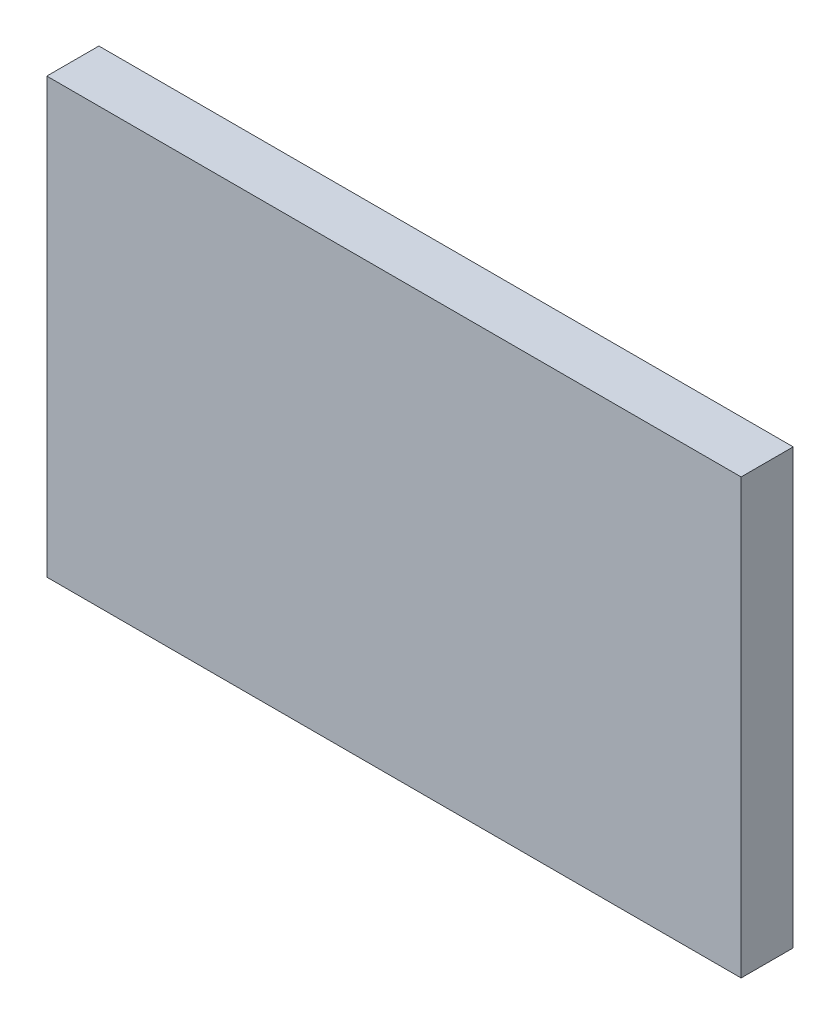
ISO-10303-21;
HEADER;
FILE_DESCRIPTION(('STEP AP214'),'2;1');
FILE_NAME('part.step','',(''),(''),'','','');
FILE_SCHEMA(('AUTOMOTIVE_DESIGN { 1 0 10303 214 1 1 1 1 }'));
ENDSEC;
DATA;
#1=APPLICATION_CONTEXT('core data for automotive mechanical design processes');
#2=APPLICATION_PROTOCOL_DEFINITION('international standard','automotive_design',2000,#1);
#3=PRODUCT_CONTEXT('',#1,'mechanical');
#4=PRODUCT('Part','Part','',(#3));
#5=PRODUCT_RELATED_PRODUCT_CATEGORY('part','',(#4));
#6=PRODUCT_DEFINITION_FORMATION('','',#4);
#7=PRODUCT_DEFINITION_CONTEXT('part definition',#1,'design');
#8=PRODUCT_DEFINITION('design','',#6,#7);
#9=PRODUCT_DEFINITION_SHAPE('','',#8);
#10=(LENGTH_UNIT() NAMED_UNIT(*) SI_UNIT(.MILLI.,.METRE.));
#11=(NAMED_UNIT(*) PLANE_ANGLE_UNIT() SI_UNIT($,.RADIAN.));
#12=(NAMED_UNIT(*) SI_UNIT($,.STERADIAN.) SOLID_ANGLE_UNIT());
#13=UNCERTAINTY_MEASURE_WITH_UNIT(LENGTH_MEASURE(1.E-05),#10,'distance_accuracy_value','');
#14=(GEOMETRIC_REPRESENTATION_CONTEXT(3) GLOBAL_UNCERTAINTY_ASSIGNED_CONTEXT((#13)) GLOBAL_UNIT_ASSIGNED_CONTEXT((#10,
#11,#12)) REPRESENTATION_CONTEXT('',''));
#15=CARTESIAN_POINT('',(0.,0.,0.));
#16=DIRECTION('',(0.,0.,1.));
#17=DIRECTION('',(1.,0.,0.));
#18=AXIS2_PLACEMENT_3D('',#15,#16,#17);
#19=CARTESIAN_POINT('',(40.,25.,6.));
#20=DIRECTION('',(-1.,0.,0.));
#21=DIRECTION('',(0.,-1.,0.));
#22=AXIS2_PLACEMENT_3D('',#19,#20,#21);
#23=PLANE('',#22);
#24=DIRECTION('',(0.,1.,0.));
#25=VECTOR('',#24,1.);
#26=CARTESIAN_POINT('',(40.,25.,0.));
#27=LINE('',#26,#25);
#28=CARTESIAN_POINT('',(40.,-25.,0.));
#29=VERTEX_POINT('',#28);
#30=CARTESIAN_POINT('',(40.,25.,0.));
#31=VERTEX_POINT('',#30);
#32=EDGE_CURVE('E99',#29,#31,#27,.T.);
#33=ORIENTED_EDGE('',*,*,#32,.T.);
#34=DIRECTION('',(0.,0.,-1.));
#35=VECTOR('',#34,1.);
#36=CARTESIAN_POINT('',(40.,25.,6.));
#37=LINE('',#36,#35);
#38=CARTESIAN_POINT('',(40.,25.,6.));
#39=VERTEX_POINT('',#38);
#40=EDGE_CURVE('E11',#39,#31,#37,.T.);
#41=ORIENTED_EDGE('',*,*,#40,.F.);
#42=DIRECTION('',(0.,1.,0.));
#43=VECTOR('',#42,1.);
#44=CARTESIAN_POINT('',(40.,25.,6.));
#45=LINE('',#44,#43);
#46=CARTESIAN_POINT('',(40.,-25.,6.));
#47=VERTEX_POINT('',#46);
#48=EDGE_CURVE('E87',#47,#39,#45,.T.);
#49=ORIENTED_EDGE('',*,*,#48,.F.);
#50=DIRECTION('',(0.,0.,-1.));
#51=VECTOR('',#50,1.);
#52=CARTESIAN_POINT('',(40.,-25.,6.));
#53=LINE('',#52,#51);
#54=EDGE_CURVE('E95',#47,#29,#53,.T.);
#55=ORIENTED_EDGE('',*,*,#54,.T.);
#56=EDGE_LOOP('',(#33,#41,#49,#55));
#57=FACE_BOUND('',#56,.T.);
#58=ADVANCED_FACE('F36',(#57),#23,.F.);
#59=CARTESIAN_POINT('',(-40.,25.,6.));
#60=DIRECTION('',(0.,-1.,0.));
#61=DIRECTION('',(0.,0.,-1.));
#62=AXIS2_PLACEMENT_3D('',#59,#60,#61);
#63=PLANE('',#62);
#64=DIRECTION('',(-1.,0.,0.));
#65=VECTOR('',#64,1.);
#66=CARTESIAN_POINT('',(-40.,25.,0.));
#67=LINE('',#66,#65);
#68=CARTESIAN_POINT('',(-40.,25.,0.));
#69=VERTEX_POINT('',#68);
#70=EDGE_CURVE('E91',#31,#69,#67,.T.);
#71=ORIENTED_EDGE('',*,*,#70,.T.);
#72=DIRECTION('',(0.,0.,-1.));
#73=VECTOR('',#72,1.);
#74=CARTESIAN_POINT('',(-40.,25.,6.));
#75=LINE('',#74,#73);
#76=CARTESIAN_POINT('',(-40.,25.,6.));
#77=VERTEX_POINT('',#76);
#78=EDGE_CURVE('E44',#77,#69,#75,.T.);
#79=ORIENTED_EDGE('',*,*,#78,.F.);
#80=DIRECTION('',(-1.,0.,0.));
#81=VECTOR('',#80,1.);
#82=CARTESIAN_POINT('',(-40.,25.,6.));
#83=LINE('',#82,#81);
#84=EDGE_CURVE('E82',#39,#77,#83,.T.);
#85=ORIENTED_EDGE('',*,*,#84,.F.);
#86=ORIENTED_EDGE('',*,*,#40,.T.);
#87=EDGE_LOOP('',(#71,#79,#85,#86));
#88=FACE_BOUND('',#87,.T.);
#89=ADVANCED_FACE('F90',(#88),#63,.F.);
#90=CARTESIAN_POINT('',(-40.,25.,6.));
#91=DIRECTION('',(1.,0.,0.));
#92=DIRECTION('',(0.,1.,0.));
#93=AXIS2_PLACEMENT_3D('',#90,#91,#92);
#94=PLANE('',#93);
#95=DIRECTION('',(0.,-1.,0.));
#96=VECTOR('',#95,1.);
#97=CARTESIAN_POINT('',(-40.,25.,0.));
#98=LINE('',#97,#96);
#99=CARTESIAN_POINT('',(-40.,-25.,0.));
#100=VERTEX_POINT('',#99);
#101=EDGE_CURVE('E69',#69,#100,#98,.T.);
#102=ORIENTED_EDGE('',*,*,#101,.T.);
#103=DIRECTION('',(0.,0.,-1.));
#104=VECTOR('',#103,1.);
#105=CARTESIAN_POINT('',(-40.,-25.,6.));
#106=LINE('',#105,#104);
#107=CARTESIAN_POINT('',(-40.,-25.,6.));
#108=VERTEX_POINT('',#107);
#109=EDGE_CURVE('E92',#108,#100,#106,.T.);
#110=ORIENTED_EDGE('',*,*,#109,.F.);
#111=DIRECTION('',(0.,-1.,0.));
#112=VECTOR('',#111,1.);
#113=CARTESIAN_POINT('',(-40.,25.,6.));
#114=LINE('',#113,#112);
#115=EDGE_CURVE('E85',#77,#108,#114,.T.);
#116=ORIENTED_EDGE('',*,*,#115,.F.);
#117=ORIENTED_EDGE('',*,*,#78,.T.);
#118=EDGE_LOOP('',(#102,#110,#116,#117));
#119=FACE_BOUND('',#118,.T.);
#120=ADVANCED_FACE('F93',(#119),#94,.F.);
#121=CARTESIAN_POINT('',(-40.,-25.,6.));
#122=DIRECTION('',(0.,1.,0.));
#123=DIRECTION('',(0.,0.,1.));
#124=AXIS2_PLACEMENT_3D('',#121,#122,#123);
#125=PLANE('',#124);
#126=DIRECTION('',(1.,0.,0.));
#127=VECTOR('',#126,1.);
#128=CARTESIAN_POINT('',(-40.,-25.,0.));
#129=LINE('',#128,#127);
#130=EDGE_CURVE('E75',#100,#29,#129,.T.);
#131=ORIENTED_EDGE('',*,*,#130,.T.);
#132=ORIENTED_EDGE('',*,*,#54,.F.);
#133=DIRECTION('',(1.,0.,0.));
#134=VECTOR('',#133,1.);
#135=CARTESIAN_POINT('',(-40.,-25.,6.));
#136=LINE('',#135,#134);
#137=EDGE_CURVE('E52',#108,#47,#136,.T.);
#138=ORIENTED_EDGE('',*,*,#137,.F.);
#139=ORIENTED_EDGE('',*,*,#109,.T.);
#140=EDGE_LOOP('',(#131,#132,#138,#139));
#141=FACE_BOUND('',#140,.T.);
#142=ADVANCED_FACE('F106',(#141),#125,.F.);
#143=CARTESIAN_POINT('',(0.,0.,6.));
#144=DIRECTION('',(0.,0.,1.));
#145=DIRECTION('',(1.,0.,0.));
#146=AXIS2_PLACEMENT_3D('',#143,#144,#145);
#147=PLANE('',#146);
#148=ORIENTED_EDGE('',*,*,#48,.T.);
#149=ORIENTED_EDGE('',*,*,#84,.T.);
#150=ORIENTED_EDGE('',*,*,#115,.T.);
#151=ORIENTED_EDGE('',*,*,#137,.T.);
#152=EDGE_LOOP('',(#148,#149,#150,#151));
#153=FACE_BOUND('',#152,.T.);
#154=ADVANCED_FACE('F83',(#153),#147,.T.);
#155=CARTESIAN_POINT('',(0.,0.,0.));
#156=DIRECTION('',(0.,0.,1.));
#157=DIRECTION('',(1.,0.,0.));
#158=AXIS2_PLACEMENT_3D('',#155,#156,#157);
#159=PLANE('',#158);
#160=ORIENTED_EDGE('',*,*,#32,.F.);
#161=ORIENTED_EDGE('',*,*,#130,.F.);
#162=ORIENTED_EDGE('',*,*,#101,.F.);
#163=ORIENTED_EDGE('',*,*,#70,.F.);
#164=EDGE_LOOP('',(#160,#161,#162,#163));
#165=FACE_BOUND('',#164,.T.);
#166=ADVANCED_FACE('F109',(#165),#159,.F.);
#167=CLOSED_SHELL('',(#58,#89,#120,#142,#154,#166));
#168=MANIFOLD_SOLID_BREP('B2',#167);
#169=ADVANCED_BREP_SHAPE_REPRESENTATION('',(#18,#168),#14);
#170=SHAPE_DEFINITION_REPRESENTATION(#9,#169);
ENDSEC;
END-ISO-10303-21;
